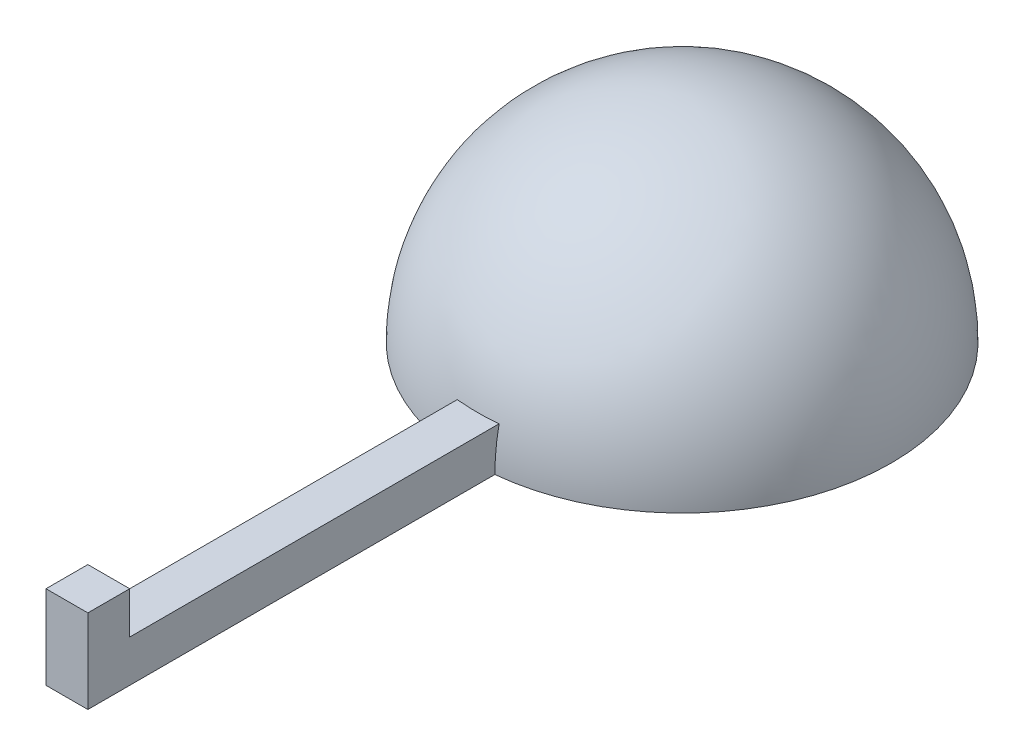
ISO-10303-21;
HEADER;
FILE_DESCRIPTION(('STEP AP214'),'2;1');
FILE_NAME('part.step','',(''),(''),'','','');
FILE_SCHEMA(('AUTOMOTIVE_DESIGN { 1 0 10303 214 1 1 1 1 }'));
ENDSEC;
DATA;
#1=APPLICATION_CONTEXT('core data for automotive mechanical design processes');
#2=APPLICATION_PROTOCOL_DEFINITION('international standard','automotive_design',2000,#1);
#3=PRODUCT_CONTEXT('',#1,'mechanical');
#4=PRODUCT('Part','Part','',(#3));
#5=PRODUCT_RELATED_PRODUCT_CATEGORY('part','',(#4));
#6=PRODUCT_DEFINITION_FORMATION('','',#4);
#7=PRODUCT_DEFINITION_CONTEXT('part definition',#1,'design');
#8=PRODUCT_DEFINITION('design','',#6,#7);
#9=PRODUCT_DEFINITION_SHAPE('','',#8);
#10=(LENGTH_UNIT() NAMED_UNIT(*) SI_UNIT(.MILLI.,.METRE.));
#11=(NAMED_UNIT(*) PLANE_ANGLE_UNIT() SI_UNIT($,.RADIAN.));
#12=(NAMED_UNIT(*) SI_UNIT($,.STERADIAN.) SOLID_ANGLE_UNIT());
#13=UNCERTAINTY_MEASURE_WITH_UNIT(LENGTH_MEASURE(1.E-05),#10,'distance_accuracy_value','');
#14=(GEOMETRIC_REPRESENTATION_CONTEXT(3) GLOBAL_UNCERTAINTY_ASSIGNED_CONTEXT((#13)) GLOBAL_UNIT_ASSIGNED_CONTEXT((#10,
#11,#12)) REPRESENTATION_CONTEXT('',''));
#15=CARTESIAN_POINT('',(0.,0.,0.));
#16=DIRECTION('',(0.,0.,1.));
#17=DIRECTION('',(1.,0.,0.));
#18=AXIS2_PLACEMENT_3D('',#15,#16,#17);
#19=CARTESIAN_POINT('',(0.,0.,0.));
#20=DIRECTION('',(-1.,0.,0.));
#21=DIRECTION('',(0.,0.,1.));
#22=AXIS2_PLACEMENT_3D('',#19,#20,#21);
#23=SPHERICAL_SURFACE('',#22,50.);
#24=CARTESIAN_POINT('',(0.,9.99999999999968,0.));
#25=DIRECTION('',(0.,-1.,0.));
#26=DIRECTION('',(0.,0.,-1.));
#27=AXIS2_PLACEMENT_3D('',#24,#25,#26);
#28=CIRCLE('',#27,48.9897948556636);
#29=CARTESIAN_POINT('',(5.,9.99999999999967,48.7339717240449));
#30=VERTEX_POINT('',#29);
#31=CARTESIAN_POINT('',(-5.,9.99999999999967,48.7339717240449));
#32=VERTEX_POINT('',#31);
#33=EDGE_CURVE('E11',#30,#32,#28,.T.);
#34=ORIENTED_EDGE('',*,*,#33,.F.);
#35=CARTESIAN_POINT('',(5.,0.,0.));
#36=DIRECTION('',(1.,0.,0.));
#37=DIRECTION('',(0.,0.,-1.));
#38=AXIS2_PLACEMENT_3D('',#35,#36,#37);
#39=CIRCLE('',#38,49.749371855331);
#40=CARTESIAN_POINT('',(5.,-3.47398006904112E-13,49.749371855331));
#41=VERTEX_POINT('',#40);
#42=EDGE_CURVE('E95',#30,#41,#39,.T.);
#43=ORIENTED_EDGE('',*,*,#42,.T.);
#44=CARTESIAN_POINT('',(0.,0.,0.));
#45=DIRECTION('',(0.,-1.,0.));
#46=DIRECTION('',(0.,0.,1.));
#47=AXIS2_PLACEMENT_3D('',#44,#45,#46);
#48=CIRCLE('',#47,50.);
#49=CARTESIAN_POINT('',(-5.,-3.19175828156412E-13,49.749371855331));
#50=VERTEX_POINT('',#49);
#51=EDGE_CURVE('E48',#50,#41,#48,.T.);
#52=ORIENTED_EDGE('',*,*,#51,.F.);
#53=CARTESIAN_POINT('',(-5.,0.,0.));
#54=DIRECTION('',(1.,0.,0.));
#55=DIRECTION('',(0.,0.,-1.));
#56=AXIS2_PLACEMENT_3D('',#53,#54,#55);
#57=CIRCLE('',#56,49.749371855331);
#58=EDGE_CURVE('E58',#32,#50,#57,.T.);
#59=ORIENTED_EDGE('',*,*,#58,.F.);
#60=EDGE_LOOP('',(#34,#43,#52,#59));
#61=FACE_BOUND('',#60,.T.);
#62=ADVANCED_FACE('F41',(#61),#23,.T.);
#63=CARTESIAN_POINT('',(0.,0.,0.));
#64=DIRECTION('',(0.,1.,0.));
#65=DIRECTION('',(0.,0.,1.));
#66=AXIS2_PLACEMENT_3D('',#63,#64,#65);
#67=PLANE('',#66);
#68=CARTESIAN_POINT('',(0.,0.,0.));
#69=DIRECTION('',(0.,1.,0.));
#70=DIRECTION('',(0.,0.,1.));
#71=AXIS2_PLACEMENT_3D('',#68,#69,#70);
#72=CIRCLE('',#71,47.);
#73=CARTESIAN_POINT('',(0.,-3.28199245851255E-13,47.));
#74=VERTEX_POINT('',#73);
#75=EDGE_CURVE('E137',#74,#74,#72,.F.);
#76=ORIENTED_EDGE('',*,*,#75,.F.);
#77=EDGE_LOOP('',(#76));
#78=FACE_BOUND('',#77,.T.);
#79=ORIENTED_EDGE('',*,*,#51,.T.);
#80=DIRECTION('',(0.,0.,-1.));
#81=VECTOR('',#80,1.);
#82=CARTESIAN_POINT('',(5.,0.,147.));
#83=LINE('',#82,#81);
#84=CARTESIAN_POINT('',(5.,0.,147.));
#85=VERTEX_POINT('',#84);
#86=EDGE_CURVE('E97',#85,#41,#83,.T.);
#87=ORIENTED_EDGE('',*,*,#86,.F.);
#88=DIRECTION('',(-1.,0.,0.));
#89=VECTOR('',#88,1.);
#90=CARTESIAN_POINT('',(5.,0.,147.));
#91=LINE('',#90,#89);
#92=CARTESIAN_POINT('',(-5.,0.,147.));
#93=VERTEX_POINT('',#92);
#94=EDGE_CURVE('E118',#85,#93,#91,.T.);
#95=ORIENTED_EDGE('',*,*,#94,.T.);
#96=DIRECTION('',(0.,0.,-1.));
#97=VECTOR('',#96,1.);
#98=CARTESIAN_POINT('',(-5.,0.,147.));
#99=LINE('',#98,#97);
#100=EDGE_CURVE('E119',#93,#50,#99,.T.);
#101=ORIENTED_EDGE('',*,*,#100,.T.);
#102=EDGE_LOOP('',(#79,#87,#95,#101));
#103=FACE_BOUND('',#102,.T.);
#104=ADVANCED_FACE('F142',(#78,#103),#67,.F.);
#105=CARTESIAN_POINT('',(0.,0.,0.));
#106=DIRECTION('',(-1.,0.,0.));
#107=DIRECTION('',(0.,0.,1.));
#108=AXIS2_PLACEMENT_3D('',#105,#106,#107);
#109=SPHERICAL_SURFACE('',#108,47.);
#110=CARTESIAN_POINT('',(0.,0.,0.));
#111=DIRECTION('',(0.,1.,0.));
#112=DIRECTION('',(0.,0.,1.));
#113=AXIS2_PLACEMENT_3D('',#110,#111,#112);
#114=SPHERICAL_SURFACE('',#113,47.);
#115=ORIENTED_EDGE('',*,*,#75,.T.);
#116=EDGE_LOOP('',(#115));
#117=FACE_BOUND('',#116,.T.);
#118=ADVANCED_FACE('F167',(#117),#114,.F.);
#119=CARTESIAN_POINT('',(5.,0.,0.));
#120=DIRECTION('',(1.,0.,0.));
#121=DIRECTION('',(0.,0.,-1.));
#122=AXIS2_PLACEMENT_3D('',#119,#120,#121);
#123=PLANE('',#122);
#124=ORIENTED_EDGE('',*,*,#42,.F.);
#125=DIRECTION('',(0.,0.,1.));
#126=VECTOR('',#125,1.);
#127=CARTESIAN_POINT('',(5.,9.99999999999967,47.));
#128=LINE('',#127,#126);
#129=CARTESIAN_POINT('',(5.,9.99999999999966,137.));
#130=VERTEX_POINT('',#129);
#131=EDGE_CURVE('E88',#30,#130,#128,.T.);
#132=ORIENTED_EDGE('',*,*,#131,.T.);
#133=DIRECTION('',(0.,1.,0.));
#134=VECTOR('',#133,1.);
#135=CARTESIAN_POINT('',(5.,9.99999999999966,137.));
#136=LINE('',#135,#134);
#137=CARTESIAN_POINT('',(5.,19.9999999999997,137.));
#138=VERTEX_POINT('',#137);
#139=EDGE_CURVE('E92',#130,#138,#136,.T.);
#140=ORIENTED_EDGE('',*,*,#139,.T.);
#141=DIRECTION('',(0.,0.,1.));
#142=VECTOR('',#141,1.);
#143=CARTESIAN_POINT('',(5.,19.9999999999997,137.));
#144=LINE('',#143,#142);
#145=CARTESIAN_POINT('',(5.,19.9999999999997,147.));
#146=VERTEX_POINT('',#145);
#147=EDGE_CURVE('E111',#138,#146,#144,.T.);
#148=ORIENTED_EDGE('',*,*,#147,.T.);
#149=DIRECTION('',(0.,-1.,0.));
#150=VECTOR('',#149,1.);
#151=CARTESIAN_POINT('',(5.,19.9999999999997,147.));
#152=LINE('',#151,#150);
#153=EDGE_CURVE('E113',#146,#85,#152,.T.);
#154=ORIENTED_EDGE('',*,*,#153,.T.);
#155=ORIENTED_EDGE('',*,*,#86,.T.);
#156=EDGE_LOOP('',(#124,#132,#140,#148,#154,#155));
#157=FACE_BOUND('',#156,.T.);
#158=ADVANCED_FACE('F90',(#157),#123,.T.);
#159=CARTESIAN_POINT('',(-5.,0.,0.));
#160=DIRECTION('',(1.,0.,0.));
#161=DIRECTION('',(0.,0.,-1.));
#162=AXIS2_PLACEMENT_3D('',#159,#160,#161);
#163=PLANE('',#162);
#164=DIRECTION('',(0.,0.,1.));
#165=VECTOR('',#164,1.);
#166=CARTESIAN_POINT('',(-5.,9.99999999999967,47.));
#167=LINE('',#166,#165);
#168=CARTESIAN_POINT('',(-5.,9.99999999999966,137.));
#169=VERTEX_POINT('',#168);
#170=EDGE_CURVE('E103',#32,#169,#167,.T.);
#171=ORIENTED_EDGE('',*,*,#170,.F.);
#172=ORIENTED_EDGE('',*,*,#58,.T.);
#173=ORIENTED_EDGE('',*,*,#100,.F.);
#174=DIRECTION('',(0.,-1.,0.));
#175=VECTOR('',#174,1.);
#176=CARTESIAN_POINT('',(-5.,19.9999999999997,147.));
#177=LINE('',#176,#175);
#178=CARTESIAN_POINT('',(-5.,19.9999999999997,147.));
#179=VERTEX_POINT('',#178);
#180=EDGE_CURVE('E127',#179,#93,#177,.T.);
#181=ORIENTED_EDGE('',*,*,#180,.F.);
#182=DIRECTION('',(0.,0.,1.));
#183=VECTOR('',#182,1.);
#184=CARTESIAN_POINT('',(-5.,19.9999999999997,137.));
#185=LINE('',#184,#183);
#186=CARTESIAN_POINT('',(-5.,19.9999999999997,137.));
#187=VERTEX_POINT('',#186);
#188=EDGE_CURVE('E125',#187,#179,#185,.T.);
#189=ORIENTED_EDGE('',*,*,#188,.F.);
#190=DIRECTION('',(0.,1.,0.));
#191=VECTOR('',#190,1.);
#192=CARTESIAN_POINT('',(-5.,9.99999999999966,137.));
#193=LINE('',#192,#191);
#194=EDGE_CURVE('E123',#169,#187,#193,.T.);
#195=ORIENTED_EDGE('',*,*,#194,.F.);
#196=EDGE_LOOP('',(#171,#172,#173,#181,#189,#195));
#197=FACE_BOUND('',#196,.T.);
#198=ADVANCED_FACE('F151',(#197),#163,.F.);
#199=CARTESIAN_POINT('',(5.,9.99999999999967,47.));
#200=DIRECTION('',(0.,-1.,0.));
#201=DIRECTION('',(0.,0.,-1.));
#202=AXIS2_PLACEMENT_3D('',#199,#200,#201);
#203=PLANE('',#202);
#204=ORIENTED_EDGE('',*,*,#131,.F.);
#205=ORIENTED_EDGE('',*,*,#33,.T.);
#206=ORIENTED_EDGE('',*,*,#170,.T.);
#207=DIRECTION('',(-1.,0.,0.));
#208=VECTOR('',#207,1.);
#209=CARTESIAN_POINT('',(5.,9.99999999999966,137.));
#210=LINE('',#209,#208);
#211=EDGE_CURVE('E100',#130,#169,#210,.T.);
#212=ORIENTED_EDGE('',*,*,#211,.F.);
#213=EDGE_LOOP('',(#204,#205,#206,#212));
#214=FACE_BOUND('',#213,.T.);
#215=ADVANCED_FACE('F101',(#214),#203,.F.);
#216=CARTESIAN_POINT('',(5.,9.99999999999966,137.));
#217=DIRECTION('',(0.,0.,1.));
#218=DIRECTION('',(1.,0.,0.));
#219=AXIS2_PLACEMENT_3D('',#216,#217,#218);
#220=PLANE('',#219);
#221=ORIENTED_EDGE('',*,*,#194,.T.);
#222=DIRECTION('',(-1.,0.,0.));
#223=VECTOR('',#222,1.);
#224=CARTESIAN_POINT('',(5.,19.9999999999997,137.));
#225=LINE('',#224,#223);
#226=EDGE_CURVE('E106',#138,#187,#225,.T.);
#227=ORIENTED_EDGE('',*,*,#226,.F.);
#228=ORIENTED_EDGE('',*,*,#139,.F.);
#229=ORIENTED_EDGE('',*,*,#211,.T.);
#230=EDGE_LOOP('',(#221,#227,#228,#229));
#231=FACE_BOUND('',#230,.T.);
#232=ADVANCED_FACE('F108',(#231),#220,.F.);
#233=CARTESIAN_POINT('',(5.,19.9999999999997,137.));
#234=DIRECTION('',(0.,-1.,0.));
#235=DIRECTION('',(0.,0.,-1.));
#236=AXIS2_PLACEMENT_3D('',#233,#234,#235);
#237=PLANE('',#236);
#238=ORIENTED_EDGE('',*,*,#188,.T.);
#239=DIRECTION('',(-1.,0.,0.));
#240=VECTOR('',#239,1.);
#241=CARTESIAN_POINT('',(5.,19.9999999999997,147.));
#242=LINE('',#241,#240);
#243=EDGE_CURVE('E131',#146,#179,#242,.T.);
#244=ORIENTED_EDGE('',*,*,#243,.F.);
#245=ORIENTED_EDGE('',*,*,#147,.F.);
#246=ORIENTED_EDGE('',*,*,#226,.T.);
#247=EDGE_LOOP('',(#238,#244,#245,#246));
#248=FACE_BOUND('',#247,.T.);
#249=ADVANCED_FACE('F154',(#248),#237,.F.);
#250=CARTESIAN_POINT('',(5.,19.9999999999997,147.));
#251=DIRECTION('',(0.,0.,-1.));
#252=DIRECTION('',(-1.,0.,0.));
#253=AXIS2_PLACEMENT_3D('',#250,#251,#252);
#254=PLANE('',#253);
#255=ORIENTED_EDGE('',*,*,#180,.T.);
#256=ORIENTED_EDGE('',*,*,#94,.F.);
#257=ORIENTED_EDGE('',*,*,#153,.F.);
#258=ORIENTED_EDGE('',*,*,#243,.T.);
#259=EDGE_LOOP('',(#255,#256,#257,#258));
#260=FACE_BOUND('',#259,.T.);
#261=ADVANCED_FACE('F148',(#260),#254,.F.);
#262=CLOSED_SHELL('',(#62,#104,#118,#158,#198,#215,#232,#249,#261));
#263=MANIFOLD_SOLID_BREP('B2',#262);
#264=ADVANCED_BREP_SHAPE_REPRESENTATION('',(#18,#263),#14);
#265=SHAPE_DEFINITION_REPRESENTATION(#9,#264);
ENDSEC;
END-ISO-10303-21;
